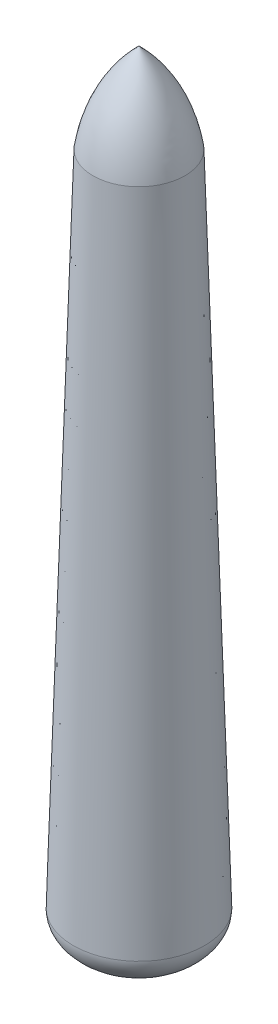
ISO-10303-21;
HEADER;
FILE_DESCRIPTION(('STEP AP214'),'2;1');
FILE_NAME('part.step','',(''),(''),'','','');
FILE_SCHEMA(('AUTOMOTIVE_DESIGN { 1 0 10303 214 1 1 1 1 }'));
ENDSEC;
DATA;
#1=APPLICATION_CONTEXT('core data for automotive mechanical design processes');
#2=APPLICATION_PROTOCOL_DEFINITION('international standard','automotive_design',2000,#1);
#3=PRODUCT_CONTEXT('',#1,'mechanical');
#4=PRODUCT('Part','Part','',(#3));
#5=PRODUCT_RELATED_PRODUCT_CATEGORY('part','',(#4));
#6=PRODUCT_DEFINITION_FORMATION('','',#4);
#7=PRODUCT_DEFINITION_CONTEXT('part definition',#1,'design');
#8=PRODUCT_DEFINITION('design','',#6,#7);
#9=PRODUCT_DEFINITION_SHAPE('','',#8);
#10=(LENGTH_UNIT() NAMED_UNIT(*) SI_UNIT(.MILLI.,.METRE.));
#11=(NAMED_UNIT(*) PLANE_ANGLE_UNIT() SI_UNIT($,.RADIAN.));
#12=(NAMED_UNIT(*) SI_UNIT($,.STERADIAN.) SOLID_ANGLE_UNIT());
#13=UNCERTAINTY_MEASURE_WITH_UNIT(LENGTH_MEASURE(1.E-05),#10,'distance_accuracy_value','');
#14=(GEOMETRIC_REPRESENTATION_CONTEXT(3) GLOBAL_UNCERTAINTY_ASSIGNED_CONTEXT((#13)) GLOBAL_UNIT_ASSIGNED_CONTEXT((#10,
#11,#12)) REPRESENTATION_CONTEXT('',''));
#15=CARTESIAN_POINT('',(0.,0.,0.));
#16=DIRECTION('',(0.,0.,1.));
#17=DIRECTION('',(1.,0.,0.));
#18=AXIS2_PLACEMENT_3D('',#15,#16,#17);
#19=CARTESIAN_POINT('',(0.,0.,25.));
#20=DIRECTION('',(0.,-1.,0.));
#21=DIRECTION('',(0.,0.,-1.));
#22=AXIS2_PLACEMENT_3D('',#19,#20,#21);
#23=CONICAL_SURFACE('',#22,25.,0.0299910048568779);
#24=CARTESIAN_POINT('',(0.,250.,25.));
#25=DIRECTION('',(0.,1.,0.));
#26=DIRECTION('',(0.,0.,1.));
#27=AXIS2_PLACEMENT_3D('',#24,#25,#26);
#28=CIRCLE('',#27,17.5);
#29=CARTESIAN_POINT('',(0.,250.,42.5));
#30=VERTEX_POINT('',#29);
#31=EDGE_CURVE('E75',#30,#30,#28,.T.);
#32=ORIENTED_EDGE('',*,*,#31,.F.);
#33=EDGE_LOOP('',(#32));
#34=FACE_BOUND('',#33,.T.);
#35=CARTESIAN_POINT('',(0.,0.,25.));
#36=DIRECTION('',(0.,1.,0.));
#37=DIRECTION('',(0.,0.,1.));
#38=AXIS2_PLACEMENT_3D('',#35,#36,#37);
#39=CIRCLE('',#38,25.);
#40=CARTESIAN_POINT('',(0.,0.,50.));
#41=VERTEX_POINT('',#40);
#42=EDGE_CURVE('E11',#41,#41,#39,.T.);
#43=ORIENTED_EDGE('',*,*,#42,.T.);
#44=EDGE_LOOP('',(#43));
#45=FACE_BOUND('',#44,.T.);
#46=ADVANCED_FACE('F41',(#34,#45),#23,.T.);
#47=CARTESIAN_POINT('',(0.,0.,25.));
#48=DIRECTION('',(1.,0.,0.));
#49=DIRECTION('',(0.,0.,1.));
#50=AXIS2_PLACEMENT_3D('',#47,#48,#49);
#51=ELLIPSE('',#50,25.,15.);
#52=TRIMMED_CURVE('',#51,(PARAMETER_VALUE(-1.5707963267949)),(PARAMETER_VALUE(1.5707963267949)),
.T.,.PARAMETER.);
#53=CARTESIAN_POINT('',(0.,250.,25.));
#54=DIRECTION('',(0.,1.,0.));
#55=AXIS1_PLACEMENT('',#53,#54);
#56=SURFACE_OF_REVOLUTION('',#52,#55);
#57=CARTESIAN_POINT('',(0.,-14.2906883881009,25.));
#58=DIRECTION('',(0.,1.,0.));
#59=DIRECTION('',(0.,0.,1.));
#60=AXIS2_PLACEMENT_3D('',#57,#58,#59);
#61=CIRCLE('',#60,7.59682415263812);
#62=CARTESIAN_POINT('',(0.,-14.2906883881009,32.5968241526381));
#63=VERTEX_POINT('',#62);
#64=EDGE_CURVE('E48',#63,#63,#61,.T.);
#65=ORIENTED_EDGE('',*,*,#64,.T.);
#66=EDGE_LOOP('',(#65));
#67=FACE_BOUND('',#66,.T.);
#68=ORIENTED_EDGE('',*,*,#42,.F.);
#69=EDGE_LOOP('',(#68));
#70=FACE_BOUND('',#69,.T.);
#71=ADVANCED_FACE('F57',(#67,#70),#56,.F.);
#72=CARTESIAN_POINT('',(0.,-15.,25.));
#73=DIRECTION('',(1.,0.,0.));
#74=DIRECTION('',(0.,0.,1.));
#75=AXIS2_PLACEMENT_3D('',#72,#73,#74);
#76=ELLIPSE('',#75,7.81850398252572,3.);
#77=TRIMMED_CURVE('',#76,(PARAMETER_VALUE(4.71238898038469)),
(PARAMETER_VALUE(7.85398163397448)),.T.,.PARAMETER.);
#78=CARTESIAN_POINT('',(0.,250.,25.));
#79=DIRECTION('',(0.,1.,0.));
#80=AXIS1_PLACEMENT('',#78,#79);
#81=SURFACE_OF_REVOLUTION('',#77,#80);
#82=ORIENTED_EDGE('',*,*,#64,.F.);
#83=EDGE_LOOP('',(#82));
#84=FACE_BOUND('',#83,.T.);
#85=CARTESIAN_POINT('',(0.,-12.,25.));
#86=VERTEX_POINT('',#85);
#87=VERTEX_LOOP('',#86);
#88=FACE_BOUND('',#87,.T.);
#89=ADVANCED_FACE('F54',(#84,#88),#81,.T.);
#90=CARTESIAN_POINT('',(0.,250.,42.5));
#91=CARTESIAN_POINT('',(0.,270.024077661446,39.5503388646867));
#92=CARTESIAN_POINT('',(0.,284.024444443645,25.));
#93=B_SPLINE_CURVE_WITH_KNOTS('',2,(#90,#91,#92),.UNSPECIFIED.,.F.,.F.,(3,3),(0.,1.),.UNSPECIFIED.);
#94=CARTESIAN_POINT('',(0.,250.,25.));
#95=DIRECTION('',(0.,1.,0.));
#96=AXIS1_PLACEMENT('',#94,#95);
#97=SURFACE_OF_REVOLUTION('',#93,#96);
#98=CARTESIAN_POINT('',(0.,284.024444443645,25.));
#99=VERTEX_POINT('',#98);
#100=VERTEX_LOOP('',#99);
#101=FACE_BOUND('',#100,.T.);
#102=ORIENTED_EDGE('',*,*,#31,.T.);
#103=EDGE_LOOP('',(#102));
#104=FACE_BOUND('',#103,.T.);
#105=ADVANCED_FACE('F56',(#101,#104),#97,.T.);
#106=CLOSED_SHELL('',(#46,#71,#89,#105));
#107=MANIFOLD_SOLID_BREP('B2',#106);
#108=ADVANCED_BREP_SHAPE_REPRESENTATION('',(#18,#107),#14);
#109=SHAPE_DEFINITION_REPRESENTATION(#9,#108);
ENDSEC;
END-ISO-10303-21;
